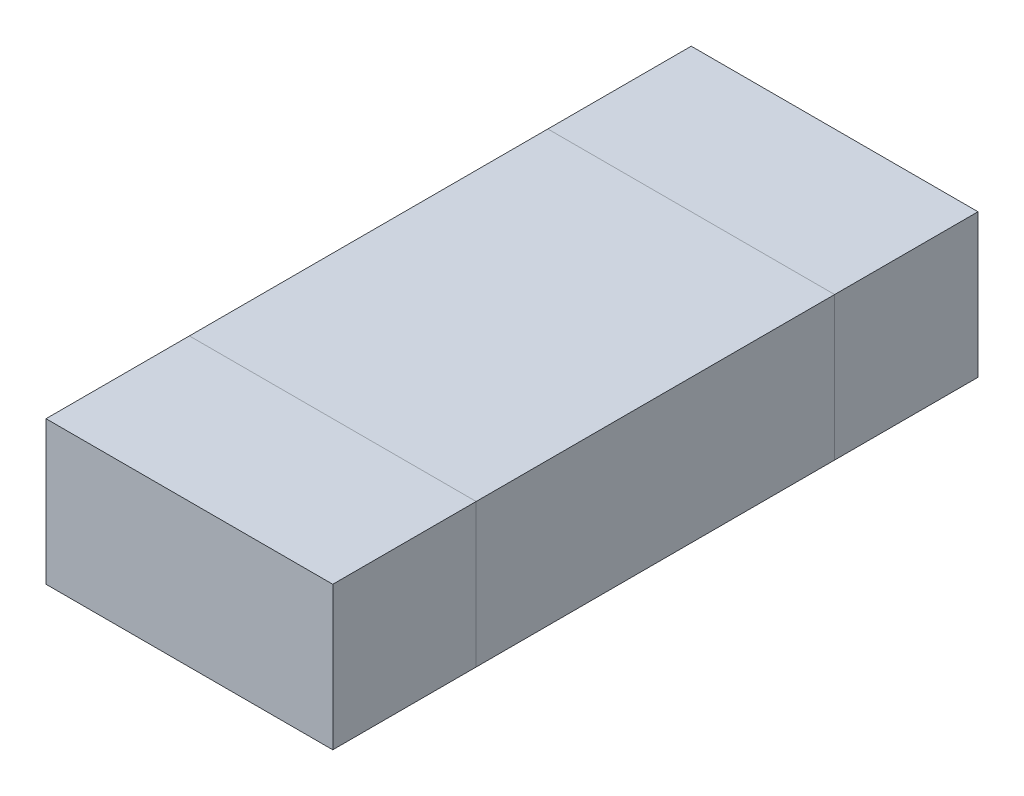
ISO-10303-21;
HEADER;
FILE_DESCRIPTION(('STEP AP214'),'2;1');
FILE_NAME('part.step','',(''),(''),'','','');
FILE_SCHEMA(('AUTOMOTIVE_DESIGN { 1 0 10303 214 1 1 1 1 }'));
ENDSEC;
DATA;
#1=APPLICATION_CONTEXT('core data for automotive mechanical design processes');
#2=APPLICATION_PROTOCOL_DEFINITION('international standard','automotive_design',2000,#1);
#3=PRODUCT_CONTEXT('',#1,'mechanical');
#4=PRODUCT('Part','Part','',(#3));
#5=PRODUCT_RELATED_PRODUCT_CATEGORY('part','',(#4));
#6=PRODUCT_DEFINITION_FORMATION('','',#4);
#7=PRODUCT_DEFINITION_CONTEXT('part definition',#1,'design');
#8=PRODUCT_DEFINITION('design','',#6,#7);
#9=PRODUCT_DEFINITION_SHAPE('','',#8);
#10=(LENGTH_UNIT() NAMED_UNIT(*) SI_UNIT(.MILLI.,.METRE.));
#11=(NAMED_UNIT(*) PLANE_ANGLE_UNIT() SI_UNIT($,.RADIAN.));
#12=(NAMED_UNIT(*) SI_UNIT($,.STERADIAN.) SOLID_ANGLE_UNIT());
#13=UNCERTAINTY_MEASURE_WITH_UNIT(LENGTH_MEASURE(1.E-05),#10,'distance_accuracy_value','');
#14=(GEOMETRIC_REPRESENTATION_CONTEXT(3) GLOBAL_UNCERTAINTY_ASSIGNED_CONTEXT((#13)) GLOBAL_UNIT_ASSIGNED_CONTEXT((#10,
#11,#12)) REPRESENTATION_CONTEXT('',''));
#15=CARTESIAN_POINT('',(0.,0.,0.));
#16=DIRECTION('',(0.,0.,1.));
#17=DIRECTION('',(1.,0.,0.));
#18=AXIS2_PLACEMENT_3D('',#15,#16,#17);
#19=CARTESIAN_POINT('',(0.,0.4,0.));
#20=DIRECTION('',(0.,1.,0.));
#21=DIRECTION('',(0.,0.,1.));
#22=AXIS2_PLACEMENT_3D('',#19,#20,#21);
#23=PLANE('',#22);
#24=DIRECTION('',(0.,0.,-1.));
#25=VECTOR('',#24,1.);
#26=CARTESIAN_POINT('',(-0.4,0.4,-0.5));
#27=LINE('',#26,#25);
#28=CARTESIAN_POINT('',(-0.4,0.4,-0.5));
#29=VERTEX_POINT('',#28);
#30=CARTESIAN_POINT('',(-0.4,0.4,-0.9));
#31=VERTEX_POINT('',#30);
#32=EDGE_CURVE('E54',#29,#31,#27,.T.);
#33=ORIENTED_EDGE('',*,*,#32,.F.);
#34=DIRECTION('',(-1.,0.,0.));
#35=VECTOR('',#34,1.);
#36=CARTESIAN_POINT('',(-0.4,0.4,-0.5));
#37=LINE('',#36,#35);
#38=CARTESIAN_POINT('',(0.4,0.4,-0.5));
#39=VERTEX_POINT('',#38);
#40=EDGE_CURVE('E77',#39,#29,#37,.T.);
#41=ORIENTED_EDGE('',*,*,#40,.F.);
#42=DIRECTION('',(0.,0.,1.));
#43=VECTOR('',#42,1.);
#44=CARTESIAN_POINT('',(0.4,0.4,-0.5));
#45=LINE('',#44,#43);
#46=CARTESIAN_POINT('',(0.4,0.4,-0.9));
#47=VERTEX_POINT('',#46);
#48=EDGE_CURVE('E82',#47,#39,#45,.T.);
#49=ORIENTED_EDGE('',*,*,#48,.F.);
#50=DIRECTION('',(1.,0.,0.));
#51=VECTOR('',#50,1.);
#52=CARTESIAN_POINT('',(-0.4,0.4,-0.9));
#53=LINE('',#52,#51);
#54=EDGE_CURVE('E97',#31,#47,#53,.T.);
#55=ORIENTED_EDGE('',*,*,#54,.F.);
#56=EDGE_LOOP('',(#33,#41,#49,#55));
#57=FACE_BOUND('',#56,.T.);
#58=ADVANCED_FACE('F46',(#57),#23,.T.);
#59=CARTESIAN_POINT('',(0.,0.,0.));
#60=DIRECTION('',(0.,-1.,0.));
#61=DIRECTION('',(0.,0.,-1.));
#62=AXIS2_PLACEMENT_3D('',#59,#60,#61);
#63=PLANE('',#62);
#64=DIRECTION('',(0.,0.,-1.));
#65=VECTOR('',#64,1.);
#66=CARTESIAN_POINT('',(-0.4,0.,-0.5));
#67=LINE('',#66,#65);
#68=CARTESIAN_POINT('',(-0.4,0.,-0.5));
#69=VERTEX_POINT('',#68);
#70=CARTESIAN_POINT('',(-0.4,0.,-0.9));
#71=VERTEX_POINT('',#70);
#72=EDGE_CURVE('E106',#69,#71,#67,.T.);
#73=ORIENTED_EDGE('',*,*,#72,.T.);
#74=DIRECTION('',(1.,0.,0.));
#75=VECTOR('',#74,1.);
#76=CARTESIAN_POINT('',(-0.4,0.,-0.9));
#77=LINE('',#76,#75);
#78=CARTESIAN_POINT('',(0.4,0.,-0.9));
#79=VERTEX_POINT('',#78);
#80=EDGE_CURVE('E95',#71,#79,#77,.T.);
#81=ORIENTED_EDGE('',*,*,#80,.T.);
#82=DIRECTION('',(0.,0.,1.));
#83=VECTOR('',#82,1.);
#84=CARTESIAN_POINT('',(0.4,0.,-0.5));
#85=LINE('',#84,#83);
#86=CARTESIAN_POINT('',(0.4,0.,-0.5));
#87=VERTEX_POINT('',#86);
#88=EDGE_CURVE('E98',#79,#87,#85,.T.);
#89=ORIENTED_EDGE('',*,*,#88,.T.);
#90=DIRECTION('',(-1.,0.,0.));
#91=VECTOR('',#90,1.);
#92=CARTESIAN_POINT('',(-0.4,0.,-0.5));
#93=LINE('',#92,#91);
#94=EDGE_CURVE('E103',#87,#69,#93,.T.);
#95=ORIENTED_EDGE('',*,*,#94,.T.);
#96=EDGE_LOOP('',(#73,#81,#89,#95));
#97=FACE_BOUND('',#96,.T.);
#98=ADVANCED_FACE('F105',(#97),#63,.T.);
#99=CARTESIAN_POINT('',(-0.4,1.29442719099992,-0.9));
#100=DIRECTION('',(0.,0.,-1.));
#101=DIRECTION('',(-1.,0.,0.));
#102=AXIS2_PLACEMENT_3D('',#99,#100,#101);
#103=PLANE('',#102);
#104=DIRECTION('',(0.,-1.,0.));
#105=VECTOR('',#104,1.);
#106=CARTESIAN_POINT('',(-0.4,1.29442719099992,-0.9));
#107=LINE('',#106,#105);
#108=EDGE_CURVE('E12',#31,#71,#107,.T.);
#109=ORIENTED_EDGE('',*,*,#108,.F.);
#110=ORIENTED_EDGE('',*,*,#54,.T.);
#111=DIRECTION('',(0.,-1.,0.));
#112=VECTOR('',#111,1.);
#113=CARTESIAN_POINT('',(0.4,1.29442719099992,-0.9));
#114=LINE('',#113,#112);
#115=EDGE_CURVE('E92',#47,#79,#114,.T.);
#116=ORIENTED_EDGE('',*,*,#115,.T.);
#117=ORIENTED_EDGE('',*,*,#80,.F.);
#118=EDGE_LOOP('',(#109,#110,#116,#117));
#119=FACE_BOUND('',#118,.T.);
#120=ADVANCED_FACE('F93',(#119),#103,.T.);
#121=CARTESIAN_POINT('',(0.4,1.29442719099992,-0.5));
#122=DIRECTION('',(1.,0.,0.));
#123=DIRECTION('',(0.,0.,-1.));
#124=AXIS2_PLACEMENT_3D('',#121,#122,#123);
#125=PLANE('',#124);
#126=ORIENTED_EDGE('',*,*,#115,.F.);
#127=ORIENTED_EDGE('',*,*,#48,.T.);
#128=DIRECTION('',(0.,-1.,0.));
#129=VECTOR('',#128,1.);
#130=CARTESIAN_POINT('',(0.4,1.29442719099992,-0.5));
#131=LINE('',#130,#129);
#132=EDGE_CURVE('E87',#39,#87,#131,.T.);
#133=ORIENTED_EDGE('',*,*,#132,.T.);
#134=ORIENTED_EDGE('',*,*,#88,.F.);
#135=EDGE_LOOP('',(#126,#127,#133,#134));
#136=FACE_BOUND('',#135,.T.);
#137=ADVANCED_FACE('F99',(#136),#125,.T.);
#138=CARTESIAN_POINT('',(-0.4,1.29442719099992,-0.5));
#139=DIRECTION('',(0.,0.,1.));
#140=DIRECTION('',(1.,0.,0.));
#141=AXIS2_PLACEMENT_3D('',#138,#139,#140);
#142=PLANE('',#141);
#143=ORIENTED_EDGE('',*,*,#132,.F.);
#144=ORIENTED_EDGE('',*,*,#40,.T.);
#145=DIRECTION('',(0.,-1.,0.));
#146=VECTOR('',#145,1.);
#147=CARTESIAN_POINT('',(-0.4,1.29442719099992,-0.5));
#148=LINE('',#147,#146);
#149=EDGE_CURVE('E113',#29,#69,#148,.T.);
#150=ORIENTED_EDGE('',*,*,#149,.T.);
#151=ORIENTED_EDGE('',*,*,#94,.F.);
#152=EDGE_LOOP('',(#143,#144,#150,#151));
#153=FACE_BOUND('',#152,.T.);
#154=ADVANCED_FACE('F119',(#153),#142,.T.);
#155=CARTESIAN_POINT('',(-0.4,1.29442719099992,-0.5));
#156=DIRECTION('',(-1.,0.,0.));
#157=DIRECTION('',(0.,0.,1.));
#158=AXIS2_PLACEMENT_3D('',#155,#156,#157);
#159=PLANE('',#158);
#160=ORIENTED_EDGE('',*,*,#149,.F.);
#161=ORIENTED_EDGE('',*,*,#32,.T.);
#162=ORIENTED_EDGE('',*,*,#108,.T.);
#163=ORIENTED_EDGE('',*,*,#72,.F.);
#164=EDGE_LOOP('',(#160,#161,#162,#163));
#165=FACE_BOUND('',#164,.T.);
#166=ADVANCED_FACE('F120',(#165),#159,.T.);
#167=CLOSED_SHELL('',(#58,#98,#120,#137,#154,#166));
#168=MANIFOLD_SOLID_BREP('B2',#167);
#169=CARTESIAN_POINT('',(0.,0.4,0.));
#170=DIRECTION('',(0.,1.,0.));
#171=DIRECTION('',(0.,0.,1.));
#172=AXIS2_PLACEMENT_3D('',#169,#170,#171);
#173=PLANE('',#172);
#174=DIRECTION('',(0.,0.,-1.));
#175=VECTOR('',#174,1.);
#176=CARTESIAN_POINT('',(-0.4,0.4,0.5));
#177=LINE('',#176,#175);
#178=CARTESIAN_POINT('',(-0.4,0.4,0.9));
#179=VERTEX_POINT('',#178);
#180=CARTESIAN_POINT('',(-0.4,0.4,0.5));
#181=VERTEX_POINT('',#180);
#182=EDGE_CURVE('E187',#179,#181,#177,.T.);
#183=ORIENTED_EDGE('',*,*,#182,.F.);
#184=DIRECTION('',(-1.,0.,0.));
#185=VECTOR('',#184,1.);
#186=CARTESIAN_POINT('',(-0.4,0.4,0.9));
#187=LINE('',#186,#185);
#188=CARTESIAN_POINT('',(0.4,0.4,0.9));
#189=VERTEX_POINT('',#188);
#190=EDGE_CURVE('E210',#189,#179,#187,.T.);
#191=ORIENTED_EDGE('',*,*,#190,.F.);
#192=DIRECTION('',(0.,0.,1.));
#193=VECTOR('',#192,1.);
#194=CARTESIAN_POINT('',(0.4,0.4,0.5));
#195=LINE('',#194,#193);
#196=CARTESIAN_POINT('',(0.4,0.4,0.5));
#197=VERTEX_POINT('',#196);
#198=EDGE_CURVE('E215',#197,#189,#195,.T.);
#199=ORIENTED_EDGE('',*,*,#198,.F.);
#200=DIRECTION('',(1.,0.,0.));
#201=VECTOR('',#200,1.);
#202=CARTESIAN_POINT('',(-0.4,0.4,0.5));
#203=LINE('',#202,#201);
#204=EDGE_CURVE('E230',#181,#197,#203,.T.);
#205=ORIENTED_EDGE('',*,*,#204,.F.);
#206=EDGE_LOOP('',(#183,#191,#199,#205));
#207=FACE_BOUND('',#206,.T.);
#208=ADVANCED_FACE('F179',(#207),#173,.T.);
#209=CARTESIAN_POINT('',(0.,0.,0.));
#210=DIRECTION('',(0.,1.,0.));
#211=DIRECTION('',(0.,0.,1.));
#212=AXIS2_PLACEMENT_3D('',#209,#210,#211);
#213=PLANE('',#212);
#214=DIRECTION('',(0.,0.,-1.));
#215=VECTOR('',#214,1.);
#216=CARTESIAN_POINT('',(-0.4,0.,0.5));
#217=LINE('',#216,#215);
#218=CARTESIAN_POINT('',(-0.4,0.,0.9));
#219=VERTEX_POINT('',#218);
#220=CARTESIAN_POINT('',(-0.4,0.,0.5));
#221=VERTEX_POINT('',#220);
#222=EDGE_CURVE('E239',#219,#221,#217,.T.);
#223=ORIENTED_EDGE('',*,*,#222,.T.);
#224=DIRECTION('',(1.,0.,0.));
#225=VECTOR('',#224,1.);
#226=CARTESIAN_POINT('',(-0.4,0.,0.5));
#227=LINE('',#226,#225);
#228=CARTESIAN_POINT('',(0.4,0.,0.5));
#229=VERTEX_POINT('',#228);
#230=EDGE_CURVE('E228',#221,#229,#227,.T.);
#231=ORIENTED_EDGE('',*,*,#230,.T.);
#232=DIRECTION('',(0.,0.,1.));
#233=VECTOR('',#232,1.);
#234=CARTESIAN_POINT('',(0.4,0.,0.5));
#235=LINE('',#234,#233);
#236=CARTESIAN_POINT('',(0.4,0.,0.9));
#237=VERTEX_POINT('',#236);
#238=EDGE_CURVE('E231',#229,#237,#235,.T.);
#239=ORIENTED_EDGE('',*,*,#238,.T.);
#240=DIRECTION('',(-1.,0.,0.));
#241=VECTOR('',#240,1.);
#242=CARTESIAN_POINT('',(-0.4,0.,0.9));
#243=LINE('',#242,#241);
#244=EDGE_CURVE('E236',#237,#219,#243,.T.);
#245=ORIENTED_EDGE('',*,*,#244,.T.);
#246=EDGE_LOOP('',(#223,#231,#239,#245));
#247=FACE_BOUND('',#246,.T.);
#248=ADVANCED_FACE('F238',(#247),#213,.F.);
#249=CARTESIAN_POINT('',(-0.4,1.29442719099992,0.5));
#250=DIRECTION('',(0.,0.,-1.));
#251=DIRECTION('',(-1.,0.,0.));
#252=AXIS2_PLACEMENT_3D('',#249,#250,#251);
#253=PLANE('',#252);
#254=DIRECTION('',(0.,-1.,0.));
#255=VECTOR('',#254,1.);
#256=CARTESIAN_POINT('',(-0.4,1.29442719099992,0.5));
#257=LINE('',#256,#255);
#258=EDGE_CURVE('E44',#181,#221,#257,.T.);
#259=ORIENTED_EDGE('',*,*,#258,.F.);
#260=ORIENTED_EDGE('',*,*,#204,.T.);
#261=DIRECTION('',(0.,-1.,0.));
#262=VECTOR('',#261,1.);
#263=CARTESIAN_POINT('',(0.4,1.29442719099992,0.5));
#264=LINE('',#263,#262);
#265=EDGE_CURVE('E225',#197,#229,#264,.T.);
#266=ORIENTED_EDGE('',*,*,#265,.T.);
#267=ORIENTED_EDGE('',*,*,#230,.F.);
#268=EDGE_LOOP('',(#259,#260,#266,#267));
#269=FACE_BOUND('',#268,.T.);
#270=ADVANCED_FACE('F226',(#269),#253,.T.);
#271=CARTESIAN_POINT('',(0.4,1.29442719099992,0.5));
#272=DIRECTION('',(1.,0.,0.));
#273=DIRECTION('',(0.,0.,-1.));
#274=AXIS2_PLACEMENT_3D('',#271,#272,#273);
#275=PLANE('',#274);
#276=ORIENTED_EDGE('',*,*,#265,.F.);
#277=ORIENTED_EDGE('',*,*,#198,.T.);
#278=DIRECTION('',(0.,-1.,0.));
#279=VECTOR('',#278,1.);
#280=CARTESIAN_POINT('',(0.4,1.29442719099992,0.9));
#281=LINE('',#280,#279);
#282=EDGE_CURVE('E220',#189,#237,#281,.T.);
#283=ORIENTED_EDGE('',*,*,#282,.T.);
#284=ORIENTED_EDGE('',*,*,#238,.F.);
#285=EDGE_LOOP('',(#276,#277,#283,#284));
#286=FACE_BOUND('',#285,.T.);
#287=ADVANCED_FACE('F232',(#286),#275,.T.);
#288=CARTESIAN_POINT('',(-0.4,1.29442719099992,0.9));
#289=DIRECTION('',(0.,0.,1.));
#290=DIRECTION('',(1.,0.,0.));
#291=AXIS2_PLACEMENT_3D('',#288,#289,#290);
#292=PLANE('',#291);
#293=ORIENTED_EDGE('',*,*,#282,.F.);
#294=ORIENTED_EDGE('',*,*,#190,.T.);
#295=DIRECTION('',(0.,-1.,0.));
#296=VECTOR('',#295,1.);
#297=CARTESIAN_POINT('',(-0.4,1.29442719099992,0.9));
#298=LINE('',#297,#296);
#299=EDGE_CURVE('E246',#179,#219,#298,.T.);
#300=ORIENTED_EDGE('',*,*,#299,.T.);
#301=ORIENTED_EDGE('',*,*,#244,.F.);
#302=EDGE_LOOP('',(#293,#294,#300,#301));
#303=FACE_BOUND('',#302,.T.);
#304=ADVANCED_FACE('F252',(#303),#292,.T.);
#305=CARTESIAN_POINT('',(-0.4,1.29442719099992,0.5));
#306=DIRECTION('',(-1.,0.,0.));
#307=DIRECTION('',(0.,0.,1.));
#308=AXIS2_PLACEMENT_3D('',#305,#306,#307);
#309=PLANE('',#308);
#310=ORIENTED_EDGE('',*,*,#299,.F.);
#311=ORIENTED_EDGE('',*,*,#182,.T.);
#312=ORIENTED_EDGE('',*,*,#258,.T.);
#313=ORIENTED_EDGE('',*,*,#222,.F.);
#314=EDGE_LOOP('',(#310,#311,#312,#313));
#315=FACE_BOUND('',#314,.T.);
#316=ADVANCED_FACE('F253',(#315),#309,.T.);
#317=CLOSED_SHELL('',(#208,#248,#270,#287,#304,#316));
#318=MANIFOLD_SOLID_BREP('B6',#317);
#319=CARTESIAN_POINT('',(0.4,0.4,-0.5));
#320=DIRECTION('',(-1.,0.,0.));
#321=DIRECTION('',(0.,0.,1.));
#322=AXIS2_PLACEMENT_3D('',#319,#320,#321);
#323=PLANE('',#322);
#324=DIRECTION('',(0.,0.,-1.));
#325=VECTOR('',#324,1.);
#326=CARTESIAN_POINT('',(0.4,0.,-0.5));
#327=LINE('',#326,#325);
#328=CARTESIAN_POINT('',(0.4,0.,0.5));
#329=VERTEX_POINT('',#328);
#330=CARTESIAN_POINT('',(0.4,0.,-0.5));
#331=VERTEX_POINT('',#330);
#332=EDGE_CURVE('E366',#329,#331,#327,.T.);
#333=ORIENTED_EDGE('',*,*,#332,.T.);
#334=DIRECTION('',(0.,-1.,0.));
#335=VECTOR('',#334,1.);
#336=CARTESIAN_POINT('',(0.4,0.4,-0.5));
#337=LINE('',#336,#335);
#338=CARTESIAN_POINT('',(0.4,0.4,-0.5));
#339=VERTEX_POINT('',#338);
#340=EDGE_CURVE('E177',#339,#331,#337,.T.);
#341=ORIENTED_EDGE('',*,*,#340,.F.);
#342=DIRECTION('',(0.,0.,-1.));
#343=VECTOR('',#342,1.);
#344=CARTESIAN_POINT('',(0.4,0.4,-0.5));
#345=LINE('',#344,#343);
#346=CARTESIAN_POINT('',(0.4,0.4,0.5));
#347=VERTEX_POINT('',#346);
#348=EDGE_CURVE('E354',#347,#339,#345,.T.);
#349=ORIENTED_EDGE('',*,*,#348,.F.);
#350=DIRECTION('',(0.,-1.,0.));
#351=VECTOR('',#350,1.);
#352=CARTESIAN_POINT('',(0.4,0.4,0.5));
#353=LINE('',#352,#351);
#354=EDGE_CURVE('E362',#347,#329,#353,.T.);
#355=ORIENTED_EDGE('',*,*,#354,.T.);
#356=EDGE_LOOP('',(#333,#341,#349,#355));
#357=FACE_BOUND('',#356,.T.);
#358=ADVANCED_FACE('F303',(#357),#323,.F.);
#359=CARTESIAN_POINT('',(-0.4,0.4,-0.5));
#360=DIRECTION('',(0.,0.,1.));
#361=DIRECTION('',(1.,0.,0.));
#362=AXIS2_PLACEMENT_3D('',#359,#360,#361);
#363=PLANE('',#362);
#364=DIRECTION('',(-1.,0.,0.));
#365=VECTOR('',#364,1.);
#366=CARTESIAN_POINT('',(-0.4,0.,-0.5));
#367=LINE('',#366,#365);
#368=CARTESIAN_POINT('',(-0.4,0.,-0.5));
#369=VERTEX_POINT('',#368);
#370=EDGE_CURVE('E358',#331,#369,#367,.T.);
#371=ORIENTED_EDGE('',*,*,#370,.T.);
#372=DIRECTION('',(0.,-1.,0.));
#373=VECTOR('',#372,1.);
#374=CARTESIAN_POINT('',(-0.4,0.4,-0.5));
#375=LINE('',#374,#373);
#376=CARTESIAN_POINT('',(-0.4,0.4,-0.5));
#377=VERTEX_POINT('',#376);
#378=EDGE_CURVE('E311',#377,#369,#375,.T.);
#379=ORIENTED_EDGE('',*,*,#378,.F.);
#380=DIRECTION('',(-1.,0.,0.));
#381=VECTOR('',#380,1.);
#382=CARTESIAN_POINT('',(-0.4,0.4,-0.5));
#383=LINE('',#382,#381);
#384=EDGE_CURVE('E349',#339,#377,#383,.T.);
#385=ORIENTED_EDGE('',*,*,#384,.F.);
#386=ORIENTED_EDGE('',*,*,#340,.T.);
#387=EDGE_LOOP('',(#371,#379,#385,#386));
#388=FACE_BOUND('',#387,.T.);
#389=ADVANCED_FACE('F357',(#388),#363,.F.);
#390=CARTESIAN_POINT('',(-0.4,0.4,-0.5));
#391=DIRECTION('',(1.,0.,0.));
#392=DIRECTION('',(0.,0.,-1.));
#393=AXIS2_PLACEMENT_3D('',#390,#391,#392);
#394=PLANE('',#393);
#395=DIRECTION('',(0.,0.,1.));
#396=VECTOR('',#395,1.);
#397=CARTESIAN_POINT('',(-0.4,0.,-0.5));
#398=LINE('',#397,#396);
#399=CARTESIAN_POINT('',(-0.4,0.,0.5));
#400=VERTEX_POINT('',#399);
#401=EDGE_CURVE('E336',#369,#400,#398,.T.);
#402=ORIENTED_EDGE('',*,*,#401,.T.);
#403=DIRECTION('',(0.,-1.,0.));
#404=VECTOR('',#403,1.);
#405=CARTESIAN_POINT('',(-0.4,0.4,0.5));
#406=LINE('',#405,#404);
#407=CARTESIAN_POINT('',(-0.4,0.4,0.5));
#408=VERTEX_POINT('',#407);
#409=EDGE_CURVE('E359',#408,#400,#406,.T.);
#410=ORIENTED_EDGE('',*,*,#409,.F.);
#411=DIRECTION('',(0.,0.,1.));
#412=VECTOR('',#411,1.);
#413=CARTESIAN_POINT('',(-0.4,0.4,-0.5));
#414=LINE('',#413,#412);
#415=EDGE_CURVE('E352',#377,#408,#414,.T.);
#416=ORIENTED_EDGE('',*,*,#415,.F.);
#417=ORIENTED_EDGE('',*,*,#378,.T.);
#418=EDGE_LOOP('',(#402,#410,#416,#417));
#419=FACE_BOUND('',#418,.T.);
#420=ADVANCED_FACE('F360',(#419),#394,.F.);
#421=CARTESIAN_POINT('',(-0.4,0.4,0.5));
#422=DIRECTION('',(0.,0.,-1.));
#423=DIRECTION('',(-1.,0.,0.));
#424=AXIS2_PLACEMENT_3D('',#421,#422,#423);
#425=PLANE('',#424);
#426=DIRECTION('',(1.,0.,0.));
#427=VECTOR('',#426,1.);
#428=CARTESIAN_POINT('',(-0.4,0.,0.5));
#429=LINE('',#428,#427);
#430=EDGE_CURVE('E342',#400,#329,#429,.T.);
#431=ORIENTED_EDGE('',*,*,#430,.T.);
#432=ORIENTED_EDGE('',*,*,#354,.F.);
#433=DIRECTION('',(1.,0.,0.));
#434=VECTOR('',#433,1.);
#435=CARTESIAN_POINT('',(-0.4,0.4,0.5));
#436=LINE('',#435,#434);
#437=EDGE_CURVE('E319',#408,#347,#436,.T.);
#438=ORIENTED_EDGE('',*,*,#437,.F.);
#439=ORIENTED_EDGE('',*,*,#409,.T.);
#440=EDGE_LOOP('',(#431,#432,#438,#439));
#441=FACE_BOUND('',#440,.T.);
#442=ADVANCED_FACE('F373',(#441),#425,.F.);
#443=CARTESIAN_POINT('',(0.,0.4,0.));
#444=DIRECTION('',(0.,1.,0.));
#445=DIRECTION('',(0.,0.,1.));
#446=AXIS2_PLACEMENT_3D('',#443,#444,#445);
#447=PLANE('',#446);
#448=ORIENTED_EDGE('',*,*,#348,.T.);
#449=ORIENTED_EDGE('',*,*,#384,.T.);
#450=ORIENTED_EDGE('',*,*,#415,.T.);
#451=ORIENTED_EDGE('',*,*,#437,.T.);
#452=EDGE_LOOP('',(#448,#449,#450,#451));
#453=FACE_BOUND('',#452,.T.);
#454=ADVANCED_FACE('F350',(#453),#447,.T.);
#455=CARTESIAN_POINT('',(0.,0.,0.));
#456=DIRECTION('',(0.,1.,0.));
#457=DIRECTION('',(0.,0.,1.));
#458=AXIS2_PLACEMENT_3D('',#455,#456,#457);
#459=PLANE('',#458);
#460=ORIENTED_EDGE('',*,*,#332,.F.);
#461=ORIENTED_EDGE('',*,*,#430,.F.);
#462=ORIENTED_EDGE('',*,*,#401,.F.);
#463=ORIENTED_EDGE('',*,*,#370,.F.);
#464=EDGE_LOOP('',(#460,#461,#462,#463));
#465=FACE_BOUND('',#464,.T.);
#466=ADVANCED_FACE('F376',(#465),#459,.F.);
#467=CLOSED_SHELL('',(#358,#389,#420,#442,#454,#466));
#468=MANIFOLD_SOLID_BREP('B38',#467);
#469=ADVANCED_BREP_SHAPE_REPRESENTATION('',(#18,#168,#318,#468),#14);
#470=SHAPE_DEFINITION_REPRESENTATION(#9,#469);
ENDSEC;
END-ISO-10303-21;
